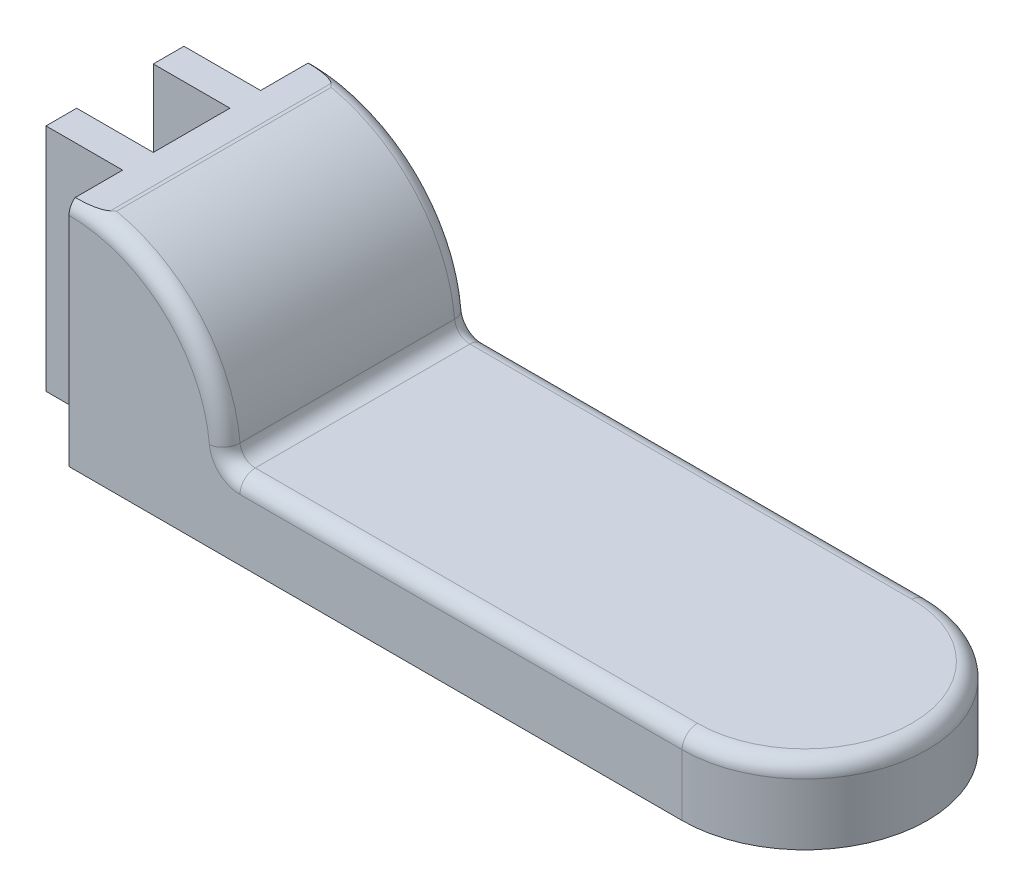
ISO-10303-21;
HEADER;
FILE_DESCRIPTION(('STEP AP214'),'2;1');
FILE_NAME('part.step','',(''),(''),'','','');
FILE_SCHEMA(('AUTOMOTIVE_DESIGN { 1 0 10303 214 1 1 1 1 }'));
ENDSEC;
DATA;
#1=APPLICATION_CONTEXT('core data for automotive mechanical design processes');
#2=APPLICATION_PROTOCOL_DEFINITION('international standard','automotive_design',2000,#1);
#3=PRODUCT_CONTEXT('',#1,'mechanical');
#4=PRODUCT('Part','Part','',(#3));
#5=PRODUCT_RELATED_PRODUCT_CATEGORY('part','',(#4));
#6=PRODUCT_DEFINITION_FORMATION('','',#4);
#7=PRODUCT_DEFINITION_CONTEXT('part definition',#1,'design');
#8=PRODUCT_DEFINITION('design','',#6,#7);
#9=PRODUCT_DEFINITION_SHAPE('','',#8);
#10=(LENGTH_UNIT() NAMED_UNIT(*) SI_UNIT(.MILLI.,.METRE.));
#11=(NAMED_UNIT(*) PLANE_ANGLE_UNIT() SI_UNIT($,.RADIAN.));
#12=(NAMED_UNIT(*) SI_UNIT($,.STERADIAN.) SOLID_ANGLE_UNIT());
#13=UNCERTAINTY_MEASURE_WITH_UNIT(LENGTH_MEASURE(1.E-05),#10,'distance_accuracy_value','');
#14=(GEOMETRIC_REPRESENTATION_CONTEXT(3) GLOBAL_UNCERTAINTY_ASSIGNED_CONTEXT((#13)) GLOBAL_UNIT_ASSIGNED_CONTEXT((#10,
#11,#12)) REPRESENTATION_CONTEXT('',''));
#15=CARTESIAN_POINT('',(0.,0.,0.));
#16=DIRECTION('',(0.,0.,1.));
#17=DIRECTION('',(1.,0.,0.));
#18=AXIS2_PLACEMENT_3D('',#15,#16,#17);
#19=CARTESIAN_POINT('',(-400.,-50.,0.));
#20=DIRECTION('',(1.,0.,0.));
#21=DIRECTION('',(0.,0.,-1.));
#22=AXIS2_PLACEMENT_3D('',#19,#20,#21);
#23=PLANE('',#22);
#24=DIRECTION('',(0.,1.,0.));
#25=VECTOR('',#24,1.);
#26=CARTESIAN_POINT('',(-400.,100.,45.));
#27=LINE('',#26,#25);
#28=CARTESIAN_POINT('',(-400.,-50.,45.));
#29=VERTEX_POINT('',#28);
#30=CARTESIAN_POINT('',(-400.,100.,45.));
#31=VERTEX_POINT('',#30);
#32=EDGE_CURVE('E51',#29,#31,#27,.T.);
#33=ORIENTED_EDGE('',*,*,#32,.F.);
#34=DIRECTION('',(0.,0.,-1.));
#35=VECTOR('',#34,1.);
#36=CARTESIAN_POINT('',(-400.,-50.,0.));
#37=LINE('',#36,#35);
#38=CARTESIAN_POINT('',(-400.,-50.,80.));
#39=VERTEX_POINT('',#38);
#40=EDGE_CURVE('E352',#39,#29,#37,.T.);
#41=ORIENTED_EDGE('',*,*,#40,.F.);
#42=DIRECTION('',(0.,1.,0.));
#43=VECTOR('',#42,1.);
#44=CARTESIAN_POINT('',(-400.,-50.,80.));
#45=LINE('',#44,#43);
#46=CARTESIAN_POINT('',(-400.,91.9803902718557,80.));
#47=VERTEX_POINT('',#46);
#48=EDGE_CURVE('E374',#39,#47,#45,.T.);
#49=ORIENTED_EDGE('',*,*,#48,.T.);
#50=CARTESIAN_POINT('',(-400.,91.9803902718557,70.));
#51=DIRECTION('',(1.,0.,0.));
#52=DIRECTION('',(0.,0.,-1.));
#53=AXIS2_PLACEMENT_3D('',#50,#51,#52);
#54=CIRCLE('',#53,10.);
#55=CARTESIAN_POINT('',(-400.,100.,75.9737642913203));
#56=VERTEX_POINT('',#55);
#57=EDGE_CURVE('E291',#47,#56,#54,.F.);
#58=ORIENTED_EDGE('',*,*,#57,.T.);
#59=DIRECTION('',(0.,0.,1.));
#60=VECTOR('',#59,1.);
#61=CARTESIAN_POINT('',(-400.,100.,-222.828568570857));
#62=LINE('',#61,#60);
#63=EDGE_CURVE('E226',#31,#56,#62,.T.);
#64=ORIENTED_EDGE('',*,*,#63,.F.);
#65=EDGE_LOOP('',(#33,#41,#49,#58,#64));
#66=FACE_BOUND('',#65,.T.);
#67=ADVANCED_FACE('F36',(#66),#23,.F.);
#68=DIRECTION('',(0.,-1.,0.));
#69=VECTOR('',#68,1.);
#70=CARTESIAN_POINT('',(-400.,100.,25.));
#71=LINE('',#70,#69);
#72=CARTESIAN_POINT('',(-400.,100.,25.));
#73=VERTEX_POINT('',#72);
#74=CARTESIAN_POINT('',(-400.,-50.,25.));
#75=VERTEX_POINT('',#74);
#76=EDGE_CURVE('E191',#73,#75,#71,.T.);
#77=ORIENTED_EDGE('',*,*,#76,.F.);
#78=CARTESIAN_POINT('',(-400.,100.,-25.));
#79=VERTEX_POINT('',#78);
#80=EDGE_CURVE('E228',#79,#73,#62,.T.);
#81=ORIENTED_EDGE('',*,*,#80,.F.);
#82=DIRECTION('',(0.,1.,0.));
#83=VECTOR('',#82,1.);
#84=CARTESIAN_POINT('',(-400.,100.,-25.));
#85=LINE('',#84,#83);
#86=CARTESIAN_POINT('',(-400.,-50.,-25.));
#87=VERTEX_POINT('',#86);
#88=EDGE_CURVE('E197',#87,#79,#85,.T.);
#89=ORIENTED_EDGE('',*,*,#88,.F.);
#90=EDGE_CURVE('E230',#75,#87,#37,.T.);
#91=ORIENTED_EDGE('',*,*,#90,.F.);
#92=EDGE_LOOP('',(#77,#81,#89,#91));
#93=FACE_BOUND('',#92,.T.);
#94=ADVANCED_FACE('F332',(#93),#23,.F.);
#95=DIRECTION('',(0.,-1.,0.));
#96=VECTOR('',#95,1.);
#97=CARTESIAN_POINT('',(-400.,100.,-45.));
#98=LINE('',#97,#96);
#99=CARTESIAN_POINT('',(-400.,100.,-45.));
#100=VERTEX_POINT('',#99);
#101=CARTESIAN_POINT('',(-400.,-50.,-45.));
#102=VERTEX_POINT('',#101);
#103=EDGE_CURVE('E194',#100,#102,#98,.T.);
#104=ORIENTED_EDGE('',*,*,#103,.F.);
#105=CARTESIAN_POINT('',(-400.,100.,-75.9737642913203));
#106=VERTEX_POINT('',#105);
#107=EDGE_CURVE('E241',#106,#100,#62,.T.);
#108=ORIENTED_EDGE('',*,*,#107,.F.);
#109=CARTESIAN_POINT('',(-400.,91.9803902718557,-70.));
#110=DIRECTION('',(1.,0.,0.));
#111=DIRECTION('',(0.,0.,-1.));
#112=AXIS2_PLACEMENT_3D('',#109,#110,#111);
#113=CIRCLE('',#112,10.);
#114=CARTESIAN_POINT('',(-400.,91.9803902718557,-80.));
#115=VERTEX_POINT('',#114);
#116=EDGE_CURVE('E414',#106,#115,#113,.F.);
#117=ORIENTED_EDGE('',*,*,#116,.T.);
#118=DIRECTION('',(0.,1.,0.));
#119=VECTOR('',#118,1.);
#120=CARTESIAN_POINT('',(-400.,-50.,-80.));
#121=LINE('',#120,#119);
#122=CARTESIAN_POINT('',(-400.,-50.,-80.));
#123=VERTEX_POINT('',#122);
#124=EDGE_CURVE('E376',#123,#115,#121,.T.);
#125=ORIENTED_EDGE('',*,*,#124,.F.);
#126=EDGE_CURVE('E59',#102,#123,#37,.T.);
#127=ORIENTED_EDGE('',*,*,#126,.F.);
#128=EDGE_LOOP('',(#104,#108,#117,#125,#127));
#129=FACE_BOUND('',#128,.T.);
#130=ADVANCED_FACE('F329',(#129),#23,.F.);
#131=CARTESIAN_POINT('',(0.,0.,0.));
#132=DIRECTION('',(0.,1.,0.));
#133=DIRECTION('',(0.,0.,1.));
#134=AXIS2_PLACEMENT_3D('',#131,#132,#133);
#135=PLANE('',#134);
#136=DIRECTION('',(-1.,0.,0.));
#137=VECTOR('',#136,1.);
#138=CARTESIAN_POINT('',(0.,0.,70.));
#139=LINE('',#138,#137);
#140=CARTESIAN_POINT('',(-288.467010237163,0.,70.));
#141=VERTEX_POINT('',#140);
#142=CARTESIAN_POINT('',(0.,0.,70.));
#143=VERTEX_POINT('',#142);
#144=EDGE_CURVE('E384',#141,#143,#139,.F.);
#145=ORIENTED_EDGE('',*,*,#144,.T.);
#146=CARTESIAN_POINT('',(0.,0.,0.));
#147=DIRECTION('',(0.,1.,0.));
#148=DIRECTION('',(0.,0.,1.));
#149=AXIS2_PLACEMENT_3D('',#146,#147,#148);
#150=CIRCLE('',#149,70.);
#151=CARTESIAN_POINT('',(0.,0.,-70.));
#152=VERTEX_POINT('',#151);
#153=EDGE_CURVE('E386',#143,#152,#150,.T.);
#154=ORIENTED_EDGE('',*,*,#153,.T.);
#155=DIRECTION('',(1.,0.,0.));
#156=VECTOR('',#155,1.);
#157=CARTESIAN_POINT('',(-298.019609728144,0.,-70.));
#158=LINE('',#157,#156);
#159=CARTESIAN_POINT('',(-288.467010237163,0.,-70.));
#160=VERTEX_POINT('',#159);
#161=EDGE_CURVE('E382',#152,#160,#158,.F.);
#162=ORIENTED_EDGE('',*,*,#161,.T.);
#163=DIRECTION('',(0.,0.,-1.));
#164=VECTOR('',#163,1.);
#165=CARTESIAN_POINT('',(-288.467010237163,0.,80.));
#166=LINE('',#165,#164);
#167=EDGE_CURVE('E373',#160,#141,#166,.F.);
#168=ORIENTED_EDGE('',*,*,#167,.T.);
#169=EDGE_LOOP('',(#145,#154,#162,#168));
#170=FACE_BOUND('',#169,.T.);
#171=ADVANCED_FACE('F323',(#170),#135,.T.);
#172=CARTESIAN_POINT('',(0.,-50.,0.));
#173=DIRECTION('',(0.,1.,0.));
#174=DIRECTION('',(0.,0.,1.));
#175=AXIS2_PLACEMENT_3D('',#172,#173,#174);
#176=CYLINDRICAL_SURFACE('',#175,80.);
#177=DIRECTION('',(0.,1.,0.));
#178=VECTOR('',#177,1.);
#179=CARTESIAN_POINT('',(0.,-50.,-80.));
#180=LINE('',#179,#178);
#181=CARTESIAN_POINT('',(0.,-50.,-80.));
#182=VERTEX_POINT('',#181);
#183=CARTESIAN_POINT('',(0.,-10.,-80.));
#184=VERTEX_POINT('',#183);
#185=EDGE_CURVE('E361',#182,#184,#180,.T.);
#186=ORIENTED_EDGE('',*,*,#185,.T.);
#187=CARTESIAN_POINT('',(0.,-10.,0.));
#188=DIRECTION('',(0.,1.,0.));
#189=DIRECTION('',(0.,0.,1.));
#190=AXIS2_PLACEMENT_3D('',#187,#188,#189);
#191=CIRCLE('',#190,80.);
#192=CARTESIAN_POINT('',(0.,-10.,80.));
#193=VERTEX_POINT('',#192);
#194=EDGE_CURVE('E389',#184,#193,#191,.F.);
#195=ORIENTED_EDGE('',*,*,#194,.T.);
#196=DIRECTION('',(0.,1.,0.));
#197=VECTOR('',#196,1.);
#198=CARTESIAN_POINT('',(0.,-50.,80.));
#199=LINE('',#198,#197);
#200=CARTESIAN_POINT('',(0.,-50.,80.));
#201=VERTEX_POINT('',#200);
#202=EDGE_CURVE('E370',#201,#193,#199,.T.);
#203=ORIENTED_EDGE('',*,*,#202,.F.);
#204=CARTESIAN_POINT('',(0.,-50.,0.));
#205=DIRECTION('',(0.,1.,0.));
#206=DIRECTION('',(0.,0.,1.));
#207=AXIS2_PLACEMENT_3D('',#204,#205,#206);
#208=CIRCLE('',#207,80.);
#209=EDGE_CURVE('E234',#201,#182,#208,.T.);
#210=ORIENTED_EDGE('',*,*,#209,.T.);
#211=EDGE_LOOP('',(#186,#195,#203,#210));
#212=FACE_BOUND('',#211,.T.);
#213=ADVANCED_FACE('F319',(#212),#176,.T.);
#214=CARTESIAN_POINT('',(0.,-50.,80.));
#215=DIRECTION('',(0.,0.,-1.));
#216=DIRECTION('',(-1.,0.,0.));
#217=AXIS2_PLACEMENT_3D('',#214,#215,#216);
#218=PLANE('',#217);
#219=ORIENTED_EDGE('',*,*,#202,.T.);
#220=DIRECTION('',(-1.,0.,0.));
#221=VECTOR('',#220,1.);
#222=CARTESIAN_POINT('',(-298.019609728144,-10.,80.));
#223=LINE('',#222,#221);
#224=CARTESIAN_POINT('',(-288.467010237163,-10.,80.));
#225=VERTEX_POINT('',#224);
#226=EDGE_CURVE('E397',#193,#225,#223,.T.);
#227=ORIENTED_EDGE('',*,*,#226,.T.);
#228=CARTESIAN_POINT('',(-288.467010237163,10.,80.));
#229=DIRECTION('',(0.,0.,-1.));
#230=DIRECTION('',(-1.,0.,0.));
#231=AXIS2_PLACEMENT_3D('',#228,#229,#230);
#232=CIRCLE('',#231,20.);
#233=CARTESIAN_POINT('',(-308.387103298469,8.21397300442998,80.));
#234=VERTEX_POINT('',#233);
#235=EDGE_CURVE('E394',#234,#225,#232,.F.);
#236=ORIENTED_EDGE('',*,*,#235,.F.);
#237=CARTESIAN_POINT('',(-400.,0.,80.));
#238=DIRECTION('',(0.,0.,-1.));
#239=DIRECTION('',(-1.,0.,0.));
#240=AXIS2_PLACEMENT_3D('',#237,#238,#239);
#241=CIRCLE('',#240,91.9803902718557);
#242=EDGE_CURVE('E392',#234,#47,#241,.F.);
#243=ORIENTED_EDGE('',*,*,#242,.T.);
#244=ORIENTED_EDGE('',*,*,#48,.F.);
#245=DIRECTION('',(-1.,0.,0.));
#246=VECTOR('',#245,1.);
#247=CARTESIAN_POINT('',(0.,-50.,80.));
#248=LINE('',#247,#246);
#249=EDGE_CURVE('E359',#201,#39,#248,.T.);
#250=ORIENTED_EDGE('',*,*,#249,.F.);
#251=EDGE_LOOP('',(#219,#227,#236,#243,#244,#250));
#252=FACE_BOUND('',#251,.T.);
#253=ADVANCED_FACE('F322',(#252),#218,.F.);
#254=CARTESIAN_POINT('',(0.,-50.,-80.));
#255=DIRECTION('',(0.,0.,1.));
#256=DIRECTION('',(1.,0.,0.));
#257=AXIS2_PLACEMENT_3D('',#254,#255,#256);
#258=PLANE('',#257);
#259=CARTESIAN_POINT('',(-288.467010237163,10.,-80.));
#260=DIRECTION('',(0.,0.,1.));
#261=DIRECTION('',(1.,0.,0.));
#262=AXIS2_PLACEMENT_3D('',#259,#260,#261);
#263=CIRCLE('',#262,20.);
#264=CARTESIAN_POINT('',(-288.467010237163,-10.,-80.));
#265=VERTEX_POINT('',#264);
#266=CARTESIAN_POINT('',(-308.387103298469,8.21397300442998,-80.));
#267=VERTEX_POINT('',#266);
#268=EDGE_CURVE('E399',#265,#267,#263,.F.);
#269=ORIENTED_EDGE('',*,*,#268,.F.);
#270=DIRECTION('',(1.,0.,0.));
#271=VECTOR('',#270,1.);
#272=CARTESIAN_POINT('',(0.,-10.,-80.));
#273=LINE('',#272,#271);
#274=EDGE_CURVE('E404',#265,#184,#273,.T.);
#275=ORIENTED_EDGE('',*,*,#274,.T.);
#276=ORIENTED_EDGE('',*,*,#185,.F.);
#277=DIRECTION('',(1.,0.,0.));
#278=VECTOR('',#277,1.);
#279=CARTESIAN_POINT('',(0.,-50.,-80.));
#280=LINE('',#279,#278);
#281=EDGE_CURVE('E366',#123,#182,#280,.T.);
#282=ORIENTED_EDGE('',*,*,#281,.F.);
#283=ORIENTED_EDGE('',*,*,#124,.T.);
#284=CARTESIAN_POINT('',(-400.,0.,-80.));
#285=DIRECTION('',(0.,0.,1.));
#286=DIRECTION('',(1.,0.,0.));
#287=AXIS2_PLACEMENT_3D('',#284,#285,#286);
#288=CIRCLE('',#287,91.9803902718557);
#289=EDGE_CURVE('E402',#115,#267,#288,.F.);
#290=ORIENTED_EDGE('',*,*,#289,.T.);
#291=EDGE_LOOP('',(#269,#275,#276,#282,#283,#290));
#292=FACE_BOUND('',#291,.T.);
#293=ADVANCED_FACE('F325',(#292),#258,.F.);
#294=CARTESIAN_POINT('',(0.,-50.,0.));
#295=DIRECTION('',(0.,1.,0.));
#296=DIRECTION('',(0.,0.,1.));
#297=AXIS2_PLACEMENT_3D('',#294,#295,#296);
#298=PLANE('',#297);
#299=CARTESIAN_POINT('',(0.,-50.,0.));
#300=DIRECTION('',(0.,1.,0.));
#301=DIRECTION('',(0.,0.,1.));
#302=AXIS2_PLACEMENT_3D('',#299,#300,#301);
#303=CIRCLE('',#302,63.);
#304=CARTESIAN_POINT('',(0.,-50.,63.));
#305=VERTEX_POINT('',#304);
#306=EDGE_CURVE('E11',#305,#305,#303,.T.);
#307=ORIENTED_EDGE('',*,*,#306,.T.);
#308=EDGE_LOOP('',(#307));
#309=FACE_BOUND('',#308,.T.);
#310=ORIENTED_EDGE('',*,*,#209,.F.);
#311=ORIENTED_EDGE('',*,*,#249,.T.);
#312=ORIENTED_EDGE('',*,*,#40,.T.);
#313=DIRECTION('',(1.,0.,0.));
#314=VECTOR('',#313,1.);
#315=CARTESIAN_POINT('',(-450.,-50.,45.));
#316=LINE('',#315,#314);
#317=CARTESIAN_POINT('',(-450.,-50.,45.));
#318=VERTEX_POINT('',#317);
#319=EDGE_CURVE('E357',#318,#29,#316,.T.);
#320=ORIENTED_EDGE('',*,*,#319,.F.);
#321=DIRECTION('',(0.,0.,1.));
#322=VECTOR('',#321,1.);
#323=CARTESIAN_POINT('',(-450.,-50.,45.));
#324=LINE('',#323,#322);
#325=CARTESIAN_POINT('',(-450.,-50.,25.));
#326=VERTEX_POINT('',#325);
#327=EDGE_CURVE('E189',#326,#318,#324,.T.);
#328=ORIENTED_EDGE('',*,*,#327,.F.);
#329=DIRECTION('',(1.,0.,0.));
#330=VECTOR('',#329,1.);
#331=CARTESIAN_POINT('',(-450.,-50.,25.));
#332=LINE('',#331,#330);
#333=EDGE_CURVE('E199',#326,#75,#332,.T.);
#334=ORIENTED_EDGE('',*,*,#333,.T.);
#335=ORIENTED_EDGE('',*,*,#90,.T.);
#336=DIRECTION('',(1.,0.,0.));
#337=VECTOR('',#336,1.);
#338=CARTESIAN_POINT('',(-450.,-50.,-25.));
#339=LINE('',#338,#337);
#340=CARTESIAN_POINT('',(-450.,-50.,-25.));
#341=VERTEX_POINT('',#340);
#342=EDGE_CURVE('E448',#341,#87,#339,.T.);
#343=ORIENTED_EDGE('',*,*,#342,.F.);
#344=DIRECTION('',(0.,0.,1.));
#345=VECTOR('',#344,1.);
#346=CARTESIAN_POINT('',(-450.,-50.,-45.));
#347=LINE('',#346,#345);
#348=CARTESIAN_POINT('',(-450.,-50.,-45.));
#349=VERTEX_POINT('',#348);
#350=EDGE_CURVE('E206',#349,#341,#347,.T.);
#351=ORIENTED_EDGE('',*,*,#350,.F.);
#352=DIRECTION('',(1.,0.,0.));
#353=VECTOR('',#352,1.);
#354=CARTESIAN_POINT('',(-450.,-50.,-45.));
#355=LINE('',#354,#353);
#356=EDGE_CURVE('E435',#349,#102,#355,.T.);
#357=ORIENTED_EDGE('',*,*,#356,.T.);
#358=ORIENTED_EDGE('',*,*,#126,.T.);
#359=ORIENTED_EDGE('',*,*,#281,.T.);
#360=EDGE_LOOP('',(#310,#311,#312,#320,#328,#334,#335,#343,#351,#357,#358,#359));
#361=FACE_BOUND('',#360,.T.);
#362=ADVANCED_FACE('F281',(#309,#361),#298,.F.);
#363=CARTESIAN_POINT('',(-400.,100.,-222.828568570857));
#364=DIRECTION('',(0.,1.,0.));
#365=DIRECTION('',(0.,0.,1.));
#366=AXIS2_PLACEMENT_3D('',#363,#364,#365);
#367=PLANE('',#366);
#368=ORIENTED_EDGE('',*,*,#107,.T.);
#369=DIRECTION('',(1.,0.,0.));
#370=VECTOR('',#369,1.);
#371=CARTESIAN_POINT('',(-450.,100.,-45.));
#372=LINE('',#371,#370);
#373=CARTESIAN_POINT('',(-450.,100.,-45.));
#374=VERTEX_POINT('',#373);
#375=EDGE_CURVE('E212',#374,#100,#372,.T.);
#376=ORIENTED_EDGE('',*,*,#375,.F.);
#377=DIRECTION('',(0.,0.,-1.));
#378=VECTOR('',#377,1.);
#379=CARTESIAN_POINT('',(-450.,100.,-45.));
#380=LINE('',#379,#378);
#381=CARTESIAN_POINT('',(-450.,100.,-25.));
#382=VERTEX_POINT('',#381);
#383=EDGE_CURVE('E210',#382,#374,#380,.T.);
#384=ORIENTED_EDGE('',*,*,#383,.F.);
#385=DIRECTION('',(1.,0.,0.));
#386=VECTOR('',#385,1.);
#387=CARTESIAN_POINT('',(-450.,100.,-25.));
#388=LINE('',#387,#386);
#389=EDGE_CURVE('E223',#382,#79,#388,.T.);
#390=ORIENTED_EDGE('',*,*,#389,.T.);
#391=ORIENTED_EDGE('',*,*,#80,.T.);
#392=DIRECTION('',(1.,0.,0.));
#393=VECTOR('',#392,1.);
#394=CARTESIAN_POINT('',(-450.,100.,25.));
#395=LINE('',#394,#393);
#396=CARTESIAN_POINT('',(-450.,100.,25.));
#397=VERTEX_POINT('',#396);
#398=EDGE_CURVE('E180',#397,#73,#395,.T.);
#399=ORIENTED_EDGE('',*,*,#398,.F.);
#400=DIRECTION('',(0.,0.,-1.));
#401=VECTOR('',#400,1.);
#402=CARTESIAN_POINT('',(-450.,100.,45.));
#403=LINE('',#402,#401);
#404=CARTESIAN_POINT('',(-450.,100.,45.));
#405=VERTEX_POINT('',#404);
#406=EDGE_CURVE('E173',#405,#397,#403,.T.);
#407=ORIENTED_EDGE('',*,*,#406,.F.);
#408=DIRECTION('',(1.,0.,0.));
#409=VECTOR('',#408,1.);
#410=CARTESIAN_POINT('',(-450.,100.,45.));
#411=LINE('',#410,#409);
#412=EDGE_CURVE('E177',#405,#31,#411,.T.);
#413=ORIENTED_EDGE('',*,*,#412,.T.);
#414=ORIENTED_EDGE('',*,*,#63,.T.);
#415=CARTESIAN_POINT('',(-400.,100.,75.9737642913203));
#416=CARTESIAN_POINT('',(-399.615269551634,100.,75.9737508765872));
#417=CARTESIAN_POINT('',(-399.230538244068,100.,75.9707832540049));
#418=CARTESIAN_POINT('',(-398.461160062845,100.,75.9588425016576));
#419=CARTESIAN_POINT('',(-398.076513191381,100.,75.9498692309951));
#420=CARTESIAN_POINT('',(-397.307156735922,100.,75.9258122227382));
#421=CARTESIAN_POINT('',(-396.922447275277,100.,75.9107244949067));
#422=CARTESIAN_POINT('',(-396.153333865738,100.,75.8742339703144));
#423=CARTESIAN_POINT('',(-395.768929914954,100.,75.8528312129431));
#424=CARTESIAN_POINT('',(-394.615238507974,100.,75.7786841494869));
#425=CARTESIAN_POINT('',(-393.846558069169,100.,75.7160335760999));
#426=CARTESIAN_POINT('',(-392.31236222483,100.,75.5609052707352));
#427=CARTESIAN_POINT('',(-391.546845955218,100.,75.4684363133592));
#428=CARTESIAN_POINT('',(-390.296478863852,100.,75.2875880023807));
#429=CARTESIAN_POINT('',(-389.810097303214,100.,75.2097890858956));
#430=CARTESIAN_POINT('',(-388.84021698561,100.,75.0372451490181));
#431=CARTESIAN_POINT('',(-388.35671875689,100.,74.9424971163637));
#432=CARTESIAN_POINT('',(-387.392505973857,100.,74.7325382375991));
#433=CARTESIAN_POINT('',(-386.911805491805,100.,74.6172621618202));
#434=CARTESIAN_POINT('',(-385.957115754882,100.,74.3618746343069));
#435=CARTESIAN_POINT('',(-385.483123504487,100.,74.2217746713322));
#436=CARTESIAN_POINT('',(-384.729990705721,100.,73.9709243673281));
#437=CARTESIAN_POINT('',(-384.447489943078,100.,73.8702819578753));
#438=CARTESIAN_POINT('',(-383.88796951036,100.,73.654841637646));
#439=CARTESIAN_POINT('',(-383.610948120934,100.,73.5400482517272));
#440=CARTESIAN_POINT('',(-383.066670495558,100.,73.2939830836055));
#441=CARTESIAN_POINT('',(-382.799357901195,100.,73.1628371890612));
#442=CARTESIAN_POINT('',(-382.27652858028,100.,72.87906143569));
#443=CARTESIAN_POINT('',(-382.020996359821,100.,72.7264609309831));
#444=CARTESIAN_POINT('',(-381.641740534813,100.,72.4696576079321));
#445=CARTESIAN_POINT('',(-381.511343317521,100.,72.3753820325155));
#446=CARTESIAN_POINT('',(-381.257631636729,100.,72.1766801468632));
#447=CARTESIAN_POINT('',(-381.134351228416,100.,72.0722105838813));
#448=CARTESIAN_POINT('',(-381.016001618129,100.,71.9620873559387));
#449=B_SPLINE_CURVE_WITH_KNOTS('',3,(#415,#416,#417,#418,#419,#420,#421,#422,#423,#424,#425,
#426,#427,#428,#429,#430,#431,#432,#433,#434,#435,#436,#437,#438,#439,#440,#441,#442,#443,#444,
#445,#446,#447,#448),.UNSPECIFIED.,.F.,.F.,(4,2,2,2,2,2,2,2,2,2,2,2,2,2,2,2,4),(0.,
1.15418104582457,2.308389170664,3.46335173688008,4.61830709923314,6.93147733562738,
9.24396749983476,10.7214223030151,12.1991399464871,13.681639795212,15.16345531085,
16.0628433293806,16.9619445056797,17.8545080990078,18.7458621639967,19.2281648877444,
19.7126112103718),.UNSPECIFIED.);
#450=CARTESIAN_POINT('',(-381.016001618129,100.,71.9620873559388));
#451=VERTEX_POINT('',#450);
#452=EDGE_CURVE('E265',#56,#451,#449,.T.);
#453=ORIENTED_EDGE('',*,*,#452,.T.);
#454=DIRECTION('',(0.,0.,1.));
#455=VECTOR('',#454,1.);
#456=CARTESIAN_POINT('',(-381.016001618129,100.,-222.828568570857));
#457=LINE('',#456,#455);
#458=CARTESIAN_POINT('',(-381.016001618129,100.,-71.9620873559388));
#459=VERTEX_POINT('',#458);
#460=EDGE_CURVE('E272',#451,#459,#457,.F.);
#461=ORIENTED_EDGE('',*,*,#460,.T.);
#462=CARTESIAN_POINT('',(-381.016001618129,100.,-71.9620873559388));
#463=CARTESIAN_POINT('',(-381.135519031959,100.,-72.0732754380669));
#464=CARTESIAN_POINT('',(-381.260061691217,100.,-72.1787269171046));
#465=CARTESIAN_POINT('',(-381.516741088594,100.,-72.3794593490315));
#466=CARTESIAN_POINT('',(-381.648862637163,100.,-72.4747596217344));
#467=CARTESIAN_POINT('',(-381.917879691905,100.,-72.6563419469626));
#468=CARTESIAN_POINT('',(-382.054740157198,100.,-72.742676692635));
#469=CARTESIAN_POINT('',(-382.332807976484,100.,-72.9081756291699));
#470=CARTESIAN_POINT('',(-382.474017701829,100.,-72.9873358120766));
#471=CARTESIAN_POINT('',(-382.898499246083,100.,-73.213267756147));
#472=CARTESIAN_POINT('',(-383.186559262235,100.,-73.3510446140214));
#473=CARTESIAN_POINT('',(-383.771415430794,100.,-73.6078973290156));
#474=CARTESIAN_POINT('',(-384.068228224106,100.,-73.726934416918));
#475=CARTESIAN_POINT('',(-384.580963272142,100.,-73.9174367487046));
#476=CARTESIAN_POINT('',(-384.795486790733,100.,-73.9927114359846));
#477=CARTESIAN_POINT('',(-385.226814809245,100.,-74.1364322478902));
#478=CARTESIAN_POINT('',(-385.443619457557,100.,-74.2048779251996));
#479=CARTESIAN_POINT('',(-386.096903869335,100.,-74.4012391028653));
#480=CARTESIAN_POINT('',(-386.536105733208,100.,-74.520125060822));
#481=CARTESIAN_POINT('',(-387.41949506373,100.,-74.7385311888553));
#482=CARTESIAN_POINT('',(-387.86368551301,100.,-74.8380390407341));
#483=CARTESIAN_POINT('',(-388.755422973289,100.,-75.020794918591));
#484=CARTESIAN_POINT('',(-389.202970337722,100.,-75.1040412067909));
#485=CARTESIAN_POINT('',(-390.10799630556,100.,-75.2578581319524));
#486=CARTESIAN_POINT('',(-390.565514946422,100.,-75.3281908445785));
#487=CARTESIAN_POINT('',(-391.482325706455,100.,-75.456202473979));
#488=CARTESIAN_POINT('',(-391.941617906585,100.,-75.5138808059876));
#489=CARTESIAN_POINT('',(-392.861121655925,100.,-75.6178687394656));
#490=CARTESIAN_POINT('',(-393.321332225896,100.,-75.6641870538906));
#491=CARTESIAN_POINT('',(-394.242677503693,100.,-75.7464908735588));
#492=CARTESIAN_POINT('',(-394.703812239783,100.,-75.782476057759));
#493=CARTESIAN_POINT('',(-395.976581150569,100.,-75.868513308331));
#494=CARTESIAN_POINT('',(-396.788914098271,100.,-75.9085489835326));
#495=CARTESIAN_POINT('',(-398.001240855762,100.,-75.9479521148383));
#496=CARTESIAN_POINT('',(-398.400940363255,100.,-75.957647253376));
#497=CARTESIAN_POINT('',(-399.200422870245,100.,-75.970548086695));
#498=CARTESIAN_POINT('',(-399.600205864099,100.,-75.9737541302162));
#499=CARTESIAN_POINT('',(-400.,100.,-75.9737642913203));
#500=B_SPLINE_CURVE_WITH_KNOTS('',3,(#462,#463,#464,#465,#466,#467,#468,#469,#470,#471,#472,
#473,#474,#475,#476,#477,#478,#479,#480,#481,#482,#483,#484,#485,#486,#487,#488,#489,#490,#491,
#492,#493,#494,#495,#496,#497,#498,#499),.UNSPECIFIED.,.F.,.F.,(4,2,2,2,2,2,2,2,2,2,2,2,2,2,2,2,
2,2,4),(0.,0.489212383637115,0.97747640338896,1.46268553275014,1.94816406699902,
2.90510020276392,3.86399076360065,4.54591008527252,5.22787404497209,6.59227458426108,
7.95753962926009,9.32295049242066,10.711430615823,12.0999748881428,13.4874508146891,
14.8749698444726,17.3143412644335,18.5137523218647,19.7130989182655),.UNSPECIFIED.);
#501=EDGE_CURVE('E286',#459,#106,#500,.T.);
#502=ORIENTED_EDGE('',*,*,#501,.T.);
#503=EDGE_LOOP('',(#368,#376,#384,#390,#391,#399,#407,#413,#414,#453,#461,#502));
#504=FACE_BOUND('',#503,.T.);
#505=ADVANCED_FACE('F176',(#504),#367,.T.);
#506=CARTESIAN_POINT('',(-400.,0.,-222.828568570857));
#507=DIRECTION('',(0.,0.,1.));
#508=DIRECTION('',(1.,0.,0.));
#509=AXIS2_PLACEMENT_3D('',#506,#507,#508);
#510=CYLINDRICAL_SURFACE('',#509,101.980390271856);
#511=CARTESIAN_POINT('',(-400.,0.,70.));
#512=DIRECTION('',(0.,0.,-1.));
#513=DIRECTION('',(-1.,0.,0.));
#514=AXIS2_PLACEMENT_3D('',#511,#512,#513);
#515=CIRCLE('',#514,101.980390271856);
#516=CARTESIAN_POINT('',(-378.952083610632,99.784694295599,70.));
#517=VERTEX_POINT('',#516);
#518=CARTESIAN_POINT('',(-298.427056767816,9.10698650221499,70.));
#519=VERTEX_POINT('',#518);
#520=EDGE_CURVE('E410',#517,#519,#515,.T.);
#521=ORIENTED_EDGE('',*,*,#520,.T.);
#522=DIRECTION('',(0.,0.,1.));
#523=VECTOR('',#522,1.);
#524=CARTESIAN_POINT('',(-298.427056767816,9.10698650221499,-222.828568570857));
#525=LINE('',#524,#523);
#526=CARTESIAN_POINT('',(-298.427056767816,9.10698650221499,-70.));
#527=VERTEX_POINT('',#526);
#528=EDGE_CURVE('E412',#519,#527,#525,.F.);
#529=ORIENTED_EDGE('',*,*,#528,.T.);
#530=CARTESIAN_POINT('',(-400.,0.,-70.));
#531=DIRECTION('',(0.,0.,1.));
#532=DIRECTION('',(1.,0.,0.));
#533=AXIS2_PLACEMENT_3D('',#530,#531,#532);
#534=CIRCLE('',#533,101.980390271856);
#535=CARTESIAN_POINT('',(-378.952083610632,99.784694295599,-70.));
#536=VERTEX_POINT('',#535);
#537=EDGE_CURVE('E406',#527,#536,#534,.T.);
#538=ORIENTED_EDGE('',*,*,#537,.T.);
#539=DIRECTION('',(0.,0.,1.));
#540=VECTOR('',#539,1.);
#541=CARTESIAN_POINT('',(-378.952083610632,99.7846942955991,-222.828568570857));
#542=LINE('',#541,#540);
#543=EDGE_CURVE('E408',#536,#517,#542,.T.);
#544=ORIENTED_EDGE('',*,*,#543,.T.);
#545=EDGE_LOOP('',(#521,#529,#538,#544));
#546=FACE_BOUND('',#545,.T.);
#547=ADVANCED_FACE('F280',(#546),#510,.T.);
#548=CARTESIAN_POINT('',(-381.016001618129,90.,-222.828568570857));
#549=DIRECTION('',(0.,0.,1.));
#550=DIRECTION('',(1.,0.,0.));
#551=AXIS2_PLACEMENT_3D('',#548,#549,#550);
#552=CYLINDRICAL_SURFACE('',#551,10.);
#553=CARTESIAN_POINT('',(-381.016001618129,100.,-71.9620873559388));
#554=CARTESIAN_POINT('',(-380.669633968151,99.9999740796905,-71.639237304986));
#555=CARTESIAN_POINT('',(-380.324688936766,99.9820056369581,-71.3146793020449));
#556=CARTESIAN_POINT('',(-379.64093868271,99.9109602568096,-70.6648777158646));
#557=CARTESIAN_POINT('',(-379.302118899587,99.8579823787186,-70.3396386405817));
#558=CARTESIAN_POINT('',(-378.962045277749,99.7867915686815,-70.009668053826));
#559=CARTESIAN_POINT('',(-378.957064030227,99.785744829313,-70.0048340141009));
#560=CARTESIAN_POINT('',(-378.952083610632,99.7846942955991,-70.));
#561=B_SPLINE_CURVE_WITH_KNOTS('',3,(#553,#554,#555,#556,#557,#558,#559,#560),.UNSPECIFIED.,.F.,
.F.,(4,2,2,4),(0.,1.42042927185905,2.83685654465708,2.85791569150898),.UNSPECIFIED.);
#562=EDGE_CURVE('E249',#459,#536,#561,.T.);
#563=ORIENTED_EDGE('',*,*,#562,.F.);
#564=ORIENTED_EDGE('',*,*,#460,.F.);
#565=CARTESIAN_POINT('',(-381.016001618129,100.,71.9620873559388));
#566=CARTESIAN_POINT('',(-380.669633968151,99.9999740796905,71.639237304986));
#567=CARTESIAN_POINT('',(-380.324688936766,99.9820056369581,71.3146793020449));
#568=CARTESIAN_POINT('',(-379.64093868271,99.9109602568096,70.6648777158646));
#569=CARTESIAN_POINT('',(-379.302118899587,99.8579823787186,70.3396386405817));
#570=CARTESIAN_POINT('',(-378.962045277749,99.7867915686815,70.009668053826));
#571=CARTESIAN_POINT('',(-378.957064030227,99.785744829313,70.0048340141009));
#572=CARTESIAN_POINT('',(-378.952083610632,99.7846942955991,70.));
#573=B_SPLINE_CURVE_WITH_KNOTS('',3,(#565,#566,#567,#568,#569,#570,#571,#572),.UNSPECIFIED.,.F.,
.F.,(4,2,2,4),(0.,1.42042927185905,2.83685654465708,2.85791569150898),.UNSPECIFIED.);
#574=EDGE_CURVE('E229',#517,#451,#573,.F.);
#575=ORIENTED_EDGE('',*,*,#574,.F.);
#576=ORIENTED_EDGE('',*,*,#543,.F.);
#577=EDGE_LOOP('',(#563,#564,#575,#576));
#578=FACE_BOUND('',#577,.T.);
#579=ADVANCED_FACE('F255',(#578),#552,.T.);
#580=CARTESIAN_POINT('',(-400.,0.,70.));
#581=DIRECTION('',(0.,0.,-1.));
#582=DIRECTION('',(-1.,0.,0.));
#583=AXIS2_PLACEMENT_3D('',#580,#581,#582);
#584=TOROIDAL_SURFACE('',#583,91.9803902718557,10.);
#585=ORIENTED_EDGE('',*,*,#57,.F.);
#586=ORIENTED_EDGE('',*,*,#242,.F.);
#587=CARTESIAN_POINT('',(-308.387103298469,8.21397300442998,70.));
#588=DIRECTION('',(0.0893013497785008,-0.996004653065305,0.));
#589=DIRECTION('',(0.996004653065305,0.0893013497785008,0.));
#590=AXIS2_PLACEMENT_3D('',#587,#588,#589);
#591=CIRCLE('',#590,10.);
#592=EDGE_CURVE('E429',#519,#234,#591,.T.);
#593=ORIENTED_EDGE('',*,*,#592,.F.);
#594=ORIENTED_EDGE('',*,*,#520,.F.);
#595=ORIENTED_EDGE('',*,*,#574,.T.);
#596=ORIENTED_EDGE('',*,*,#452,.F.);
#597=EDGE_LOOP('',(#585,#586,#593,#594,#595,#596));
#598=FACE_BOUND('',#597,.T.);
#599=ADVANCED_FACE('F258',(#598),#584,.T.);
#600=CARTESIAN_POINT('',(-288.467010237163,10.,-222.828568570857));
#601=DIRECTION('',(0.,0.,1.));
#602=DIRECTION('',(1.,0.,0.));
#603=AXIS2_PLACEMENT_3D('',#600,#601,#602);
#604=CYLINDRICAL_SURFACE('',#603,10.);
#605=CARTESIAN_POINT('',(-288.467010237163,10.,-70.));
#606=DIRECTION('',(0.,0.,1.));
#607=DIRECTION('',(1.,0.,0.));
#608=AXIS2_PLACEMENT_3D('',#605,#606,#607);
#609=CIRCLE('',#608,10.);
#610=EDGE_CURVE('E471',#527,#160,#609,.T.);
#611=ORIENTED_EDGE('',*,*,#610,.F.);
#612=ORIENTED_EDGE('',*,*,#528,.F.);
#613=CARTESIAN_POINT('',(-288.467010237163,10.,70.));
#614=DIRECTION('',(0.,0.,-1.));
#615=DIRECTION('',(-1.,0.,0.));
#616=AXIS2_PLACEMENT_3D('',#613,#614,#615);
#617=CIRCLE('',#616,10.);
#618=EDGE_CURVE('E474',#141,#519,#617,.T.);
#619=ORIENTED_EDGE('',*,*,#618,.F.);
#620=ORIENTED_EDGE('',*,*,#167,.F.);
#621=EDGE_LOOP('',(#611,#612,#619,#620));
#622=FACE_BOUND('',#621,.T.);
#623=ADVANCED_FACE('F261',(#622),#604,.F.);
#624=CARTESIAN_POINT('',(-400.,0.,-70.));
#625=DIRECTION('',(0.,0.,1.));
#626=DIRECTION('',(1.,0.,0.));
#627=AXIS2_PLACEMENT_3D('',#624,#625,#626);
#628=TOROIDAL_SURFACE('',#627,91.9803902718557,10.);
#629=ORIENTED_EDGE('',*,*,#562,.T.);
#630=ORIENTED_EDGE('',*,*,#537,.F.);
#631=CARTESIAN_POINT('',(-308.387103298469,8.21397300442998,-70.));
#632=DIRECTION('',(0.0893013497785006,-0.996004653065305,0.));
#633=DIRECTION('',(0.996004653065305,0.0893013497785006,0.));
#634=AXIS2_PLACEMENT_3D('',#631,#632,#633);
#635=CIRCLE('',#634,10.);
#636=EDGE_CURVE('E469',#267,#527,#635,.T.);
#637=ORIENTED_EDGE('',*,*,#636,.F.);
#638=ORIENTED_EDGE('',*,*,#289,.F.);
#639=ORIENTED_EDGE('',*,*,#116,.F.);
#640=ORIENTED_EDGE('',*,*,#501,.F.);
#641=EDGE_LOOP('',(#629,#630,#637,#638,#639,#640));
#642=FACE_BOUND('',#641,.T.);
#643=ADVANCED_FACE('F293',(#642),#628,.T.);
#644=CARTESIAN_POINT('',(-288.467010237163,10.,70.));
#645=DIRECTION('',(0.,0.,-1.));
#646=DIRECTION('',(-1.,0.,0.));
#647=AXIS2_PLACEMENT_3D('',#644,#645,#646);
#648=TOROIDAL_SURFACE('',#647,20.,10.);
#649=ORIENTED_EDGE('',*,*,#592,.T.);
#650=ORIENTED_EDGE('',*,*,#235,.T.);
#651=CARTESIAN_POINT('',(-288.467010237163,-10.,70.));
#652=DIRECTION('',(-1.,0.,0.));
#653=DIRECTION('',(0.,0.,1.));
#654=AXIS2_PLACEMENT_3D('',#651,#652,#653);
#655=CIRCLE('',#654,10.);
#656=EDGE_CURVE('E464',#141,#225,#655,.F.);
#657=ORIENTED_EDGE('',*,*,#656,.F.);
#658=ORIENTED_EDGE('',*,*,#618,.T.);
#659=EDGE_LOOP('',(#649,#650,#657,#658));
#660=FACE_BOUND('',#659,.T.);
#661=ADVANCED_FACE('F297',(#660),#648,.T.);
#662=CARTESIAN_POINT('',(-288.467010237163,10.,-70.));
#663=DIRECTION('',(0.,0.,1.));
#664=DIRECTION('',(1.,0.,0.));
#665=AXIS2_PLACEMENT_3D('',#662,#663,#664);
#666=TOROIDAL_SURFACE('',#665,20.,10.);
#667=ORIENTED_EDGE('',*,*,#636,.T.);
#668=ORIENTED_EDGE('',*,*,#610,.T.);
#669=CARTESIAN_POINT('',(-288.467010237163,-10.,-70.));
#670=DIRECTION('',(-1.,0.,0.));
#671=DIRECTION('',(0.,0.,1.));
#672=AXIS2_PLACEMENT_3D('',#669,#670,#671);
#673=CIRCLE('',#672,10.);
#674=EDGE_CURVE('E460',#265,#160,#673,.F.);
#675=ORIENTED_EDGE('',*,*,#674,.F.);
#676=ORIENTED_EDGE('',*,*,#268,.T.);
#677=EDGE_LOOP('',(#667,#668,#675,#676));
#678=FACE_BOUND('',#677,.T.);
#679=ADVANCED_FACE('F302',(#678),#666,.T.);
#680=CARTESIAN_POINT('',(0.,-10.,70.));
#681=DIRECTION('',(1.,0.,0.));
#682=DIRECTION('',(0.,0.,-1.));
#683=AXIS2_PLACEMENT_3D('',#680,#681,#682);
#684=CYLINDRICAL_SURFACE('',#683,10.);
#685=ORIENTED_EDGE('',*,*,#656,.T.);
#686=ORIENTED_EDGE('',*,*,#226,.F.);
#687=CARTESIAN_POINT('',(0.,-10.,70.));
#688=DIRECTION('',(1.,0.,0.));
#689=DIRECTION('',(0.,0.,-1.));
#690=AXIS2_PLACEMENT_3D('',#687,#688,#689);
#691=CIRCLE('',#690,10.);
#692=EDGE_CURVE('E455',#143,#193,#691,.T.);
#693=ORIENTED_EDGE('',*,*,#692,.F.);
#694=ORIENTED_EDGE('',*,*,#144,.F.);
#695=EDGE_LOOP('',(#685,#686,#693,#694));
#696=FACE_BOUND('',#695,.T.);
#697=ADVANCED_FACE('F306',(#696),#684,.T.);
#698=CARTESIAN_POINT('',(0.,-10.,-70.));
#699=DIRECTION('',(-1.,0.,0.));
#700=DIRECTION('',(0.,0.,1.));
#701=AXIS2_PLACEMENT_3D('',#698,#699,#700);
#702=CYLINDRICAL_SURFACE('',#701,10.);
#703=ORIENTED_EDGE('',*,*,#674,.T.);
#704=ORIENTED_EDGE('',*,*,#161,.F.);
#705=CARTESIAN_POINT('',(0.,-10.,-70.));
#706=DIRECTION('',(1.,0.,0.));
#707=DIRECTION('',(0.,0.,-1.));
#708=AXIS2_PLACEMENT_3D('',#705,#706,#707);
#709=CIRCLE('',#708,10.);
#710=EDGE_CURVE('E274',#184,#152,#709,.T.);
#711=ORIENTED_EDGE('',*,*,#710,.F.);
#712=ORIENTED_EDGE('',*,*,#274,.F.);
#713=EDGE_LOOP('',(#703,#704,#711,#712));
#714=FACE_BOUND('',#713,.T.);
#715=ADVANCED_FACE('F310',(#714),#702,.T.);
#716=CARTESIAN_POINT('',(0.,-10.,0.));
#717=DIRECTION('',(0.,1.,0.));
#718=DIRECTION('',(0.,0.,1.));
#719=AXIS2_PLACEMENT_3D('',#716,#717,#718);
#720=TOROIDAL_SURFACE('',#719,70.,10.);
#721=ORIENTED_EDGE('',*,*,#692,.T.);
#722=ORIENTED_EDGE('',*,*,#194,.F.);
#723=ORIENTED_EDGE('',*,*,#710,.T.);
#724=ORIENTED_EDGE('',*,*,#153,.F.);
#725=EDGE_LOOP('',(#721,#722,#723,#724));
#726=FACE_BOUND('',#725,.T.);
#727=ADVANCED_FACE('F314',(#726),#720,.T.);
#728=CARTESIAN_POINT('',(-450.,100.,-45.));
#729=DIRECTION('',(0.,0.,1.));
#730=DIRECTION('',(0.,-1.,0.));
#731=AXIS2_PLACEMENT_3D('',#728,#729,#730);
#732=PLANE('',#731);
#733=ORIENTED_EDGE('',*,*,#103,.T.);
#734=ORIENTED_EDGE('',*,*,#356,.F.);
#735=DIRECTION('',(0.,-1.,0.));
#736=VECTOR('',#735,1.);
#737=CARTESIAN_POINT('',(-450.,100.,-45.));
#738=LINE('',#737,#736);
#739=EDGE_CURVE('E203',#374,#349,#738,.T.);
#740=ORIENTED_EDGE('',*,*,#739,.F.);
#741=ORIENTED_EDGE('',*,*,#375,.T.);
#742=EDGE_LOOP('',(#733,#734,#740,#741));
#743=FACE_BOUND('',#742,.T.);
#744=ADVANCED_FACE('F282',(#743),#732,.F.);
#745=CARTESIAN_POINT('',(-450.,100.,-25.));
#746=DIRECTION('',(0.,0.,-1.));
#747=DIRECTION('',(0.,1.,0.));
#748=AXIS2_PLACEMENT_3D('',#745,#746,#747);
#749=PLANE('',#748);
#750=ORIENTED_EDGE('',*,*,#88,.T.);
#751=ORIENTED_EDGE('',*,*,#389,.F.);
#752=DIRECTION('',(0.,1.,0.));
#753=VECTOR('',#752,1.);
#754=CARTESIAN_POINT('',(-450.,100.,-25.));
#755=LINE('',#754,#753);
#756=EDGE_CURVE('E208',#341,#382,#755,.T.);
#757=ORIENTED_EDGE('',*,*,#756,.F.);
#758=ORIENTED_EDGE('',*,*,#342,.T.);
#759=EDGE_LOOP('',(#750,#751,#757,#758));
#760=FACE_BOUND('',#759,.T.);
#761=ADVANCED_FACE('F446',(#760),#749,.F.);
#762=CARTESIAN_POINT('',(-450.,0.,0.));
#763=DIRECTION('',(-1.,0.,0.));
#764=DIRECTION('',(0.,0.,1.));
#765=AXIS2_PLACEMENT_3D('',#762,#763,#764);
#766=PLANE('',#765);
#767=ORIENTED_EDGE('',*,*,#739,.T.);
#768=ORIENTED_EDGE('',*,*,#350,.T.);
#769=ORIENTED_EDGE('',*,*,#756,.T.);
#770=ORIENTED_EDGE('',*,*,#383,.T.);
#771=EDGE_LOOP('',(#767,#768,#769,#770));
#772=FACE_BOUND('',#771,.T.);
#773=ADVANCED_FACE('F440',(#772),#766,.T.);
#774=CARTESIAN_POINT('',(-450.,100.,45.));
#775=DIRECTION('',(0.,0.,-1.));
#776=DIRECTION('',(0.,1.,0.));
#777=AXIS2_PLACEMENT_3D('',#774,#775,#776);
#778=PLANE('',#777);
#779=ORIENTED_EDGE('',*,*,#32,.T.);
#780=ORIENTED_EDGE('',*,*,#412,.F.);
#781=DIRECTION('',(0.,1.,0.));
#782=VECTOR('',#781,1.);
#783=CARTESIAN_POINT('',(-450.,100.,45.));
#784=LINE('',#783,#782);
#785=EDGE_CURVE('E184',#318,#405,#784,.T.);
#786=ORIENTED_EDGE('',*,*,#785,.F.);
#787=ORIENTED_EDGE('',*,*,#319,.T.);
#788=EDGE_LOOP('',(#779,#780,#786,#787));
#789=FACE_BOUND('',#788,.T.);
#790=ADVANCED_FACE('F193',(#789),#778,.F.);
#791=CARTESIAN_POINT('',(-450.,100.,25.));
#792=DIRECTION('',(0.,0.,1.));
#793=DIRECTION('',(0.,-1.,0.));
#794=AXIS2_PLACEMENT_3D('',#791,#792,#793);
#795=PLANE('',#794);
#796=ORIENTED_EDGE('',*,*,#76,.T.);
#797=ORIENTED_EDGE('',*,*,#333,.F.);
#798=DIRECTION('',(0.,-1.,0.));
#799=VECTOR('',#798,1.);
#800=CARTESIAN_POINT('',(-450.,100.,25.));
#801=LINE('',#800,#799);
#802=EDGE_CURVE('E183',#397,#326,#801,.T.);
#803=ORIENTED_EDGE('',*,*,#802,.F.);
#804=ORIENTED_EDGE('',*,*,#398,.T.);
#805=EDGE_LOOP('',(#796,#797,#803,#804));
#806=FACE_BOUND('',#805,.T.);
#807=ADVANCED_FACE('F554',(#806),#795,.F.);
#808=CARTESIAN_POINT('',(-450.,0.,0.));
#809=DIRECTION('',(1.,0.,0.));
#810=DIRECTION('',(0.,0.,-1.));
#811=AXIS2_PLACEMENT_3D('',#808,#809,#810);
#812=PLANE('',#811);
#813=ORIENTED_EDGE('',*,*,#785,.T.);
#814=ORIENTED_EDGE('',*,*,#406,.T.);
#815=ORIENTED_EDGE('',*,*,#802,.T.);
#816=ORIENTED_EDGE('',*,*,#327,.T.);
#817=EDGE_LOOP('',(#813,#814,#815,#816));
#818=FACE_BOUND('',#817,.T.);
#819=ADVANCED_FACE('F187',(#818),#812,.F.);
#820=CARTESIAN_POINT('',(0.,-20.,0.));
#821=DIRECTION('',(0.,-1.,0.));
#822=DIRECTION('',(0.,0.,-1.));
#823=AXIS2_PLACEMENT_3D('',#820,#821,#822);
#824=CYLINDRICAL_SURFACE('',#823,60.);
#825=CARTESIAN_POINT('',(0.,-47.,0.));
#826=DIRECTION('',(0.,1.,0.));
#827=DIRECTION('',(0.,0.,1.));
#828=AXIS2_PLACEMENT_3D('',#825,#826,#827);
#829=CIRCLE('',#828,60.);
#830=CARTESIAN_POINT('',(0.,-47.,60.));
#831=VERTEX_POINT('',#830);
#832=EDGE_CURVE('E44',#831,#831,#829,.F.);
#833=ORIENTED_EDGE('',*,*,#832,.T.);
#834=EDGE_LOOP('',(#833));
#835=FACE_BOUND('',#834,.T.);
#836=CARTESIAN_POINT('',(0.,-20.,0.));
#837=DIRECTION('',(0.,-1.,0.));
#838=DIRECTION('',(0.,0.,-1.));
#839=AXIS2_PLACEMENT_3D('',#836,#837,#838);
#840=CIRCLE('',#839,60.);
#841=CARTESIAN_POINT('',(0.,-20.,-60.));
#842=VERTEX_POINT('',#841);
#843=EDGE_CURVE('E354',#842,#842,#840,.T.);
#844=ORIENTED_EDGE('',*,*,#843,.F.);
#845=EDGE_LOOP('',(#844));
#846=FACE_BOUND('',#845,.T.);
#847=ADVANCED_FACE('F568',(#835,#846),#824,.F.);
#848=CARTESIAN_POINT('',(0.,-20.,0.));
#849=DIRECTION('',(0.,-1.,0.));
#850=DIRECTION('',(0.,0.,-1.));
#851=AXIS2_PLACEMENT_3D('',#848,#849,#850);
#852=PLANE('',#851);
#853=ORIENTED_EDGE('',*,*,#843,.T.);
#854=EDGE_LOOP('',(#853));
#855=FACE_BOUND('',#854,.T.);
#856=ADVANCED_FACE('F576',(#855),#852,.T.);
#857=CARTESIAN_POINT('',(0.,-47.,0.));
#858=DIRECTION('',(0.,1.,0.));
#859=DIRECTION('',(0.,0.,1.));
#860=AXIS2_PLACEMENT_3D('',#857,#858,#859);
#861=TOROIDAL_SURFACE('',#860,63.,3.);
#862=ORIENTED_EDGE('',*,*,#306,.F.);
#863=EDGE_LOOP('',(#862));
#864=FACE_BOUND('',#863,.T.);
#865=ORIENTED_EDGE('',*,*,#832,.F.);
#866=EDGE_LOOP('',(#865));
#867=FACE_BOUND('',#866,.T.);
#868=ADVANCED_FACE('F38',(#864,#867),#861,.T.);
#869=CLOSED_SHELL('',(#67,#94,#130,#171,#213,#253,#293,#362,#505,#547,#579,#599,#623,#643,#661,
#679,#697,#715,#727,#744,#761,#773,#790,#807,#819,#847,#856,#868));
#870=MANIFOLD_SOLID_BREP('B2',#869);
#871=ADVANCED_BREP_SHAPE_REPRESENTATION('',(#18,#870),#14);
#872=SHAPE_DEFINITION_REPRESENTATION(#9,#871);
ENDSEC;
END-ISO-10303-21;
